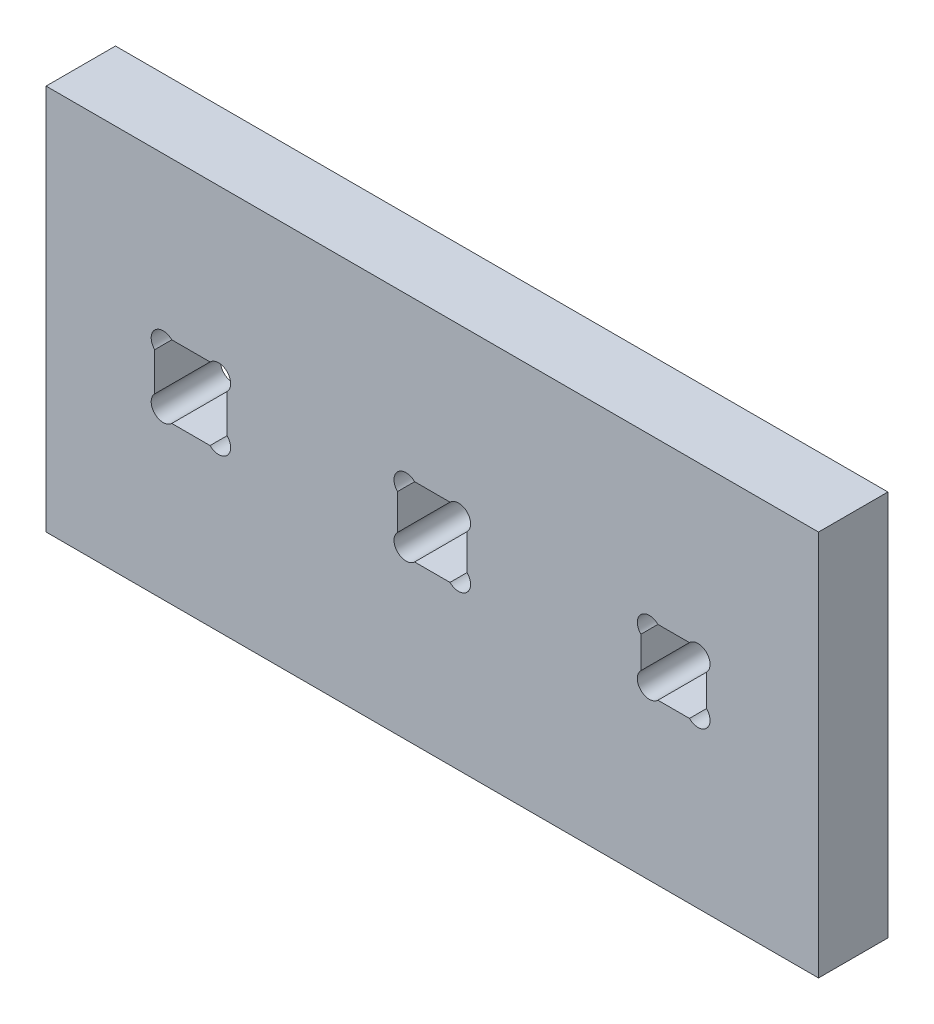
ISO-10303-21;
HEADER;
FILE_DESCRIPTION(('STEP AP214'),'2;1');
FILE_NAME('part.step','',(''),(''),'','','');
FILE_SCHEMA(('AUTOMOTIVE_DESIGN { 1 0 10303 214 1 1 1 1 }'));
ENDSEC;
DATA;
#1=APPLICATION_CONTEXT('core data for automotive mechanical design processes');
#2=APPLICATION_PROTOCOL_DEFINITION('international standard','automotive_design',2000,#1);
#3=PRODUCT_CONTEXT('',#1,'mechanical');
#4=PRODUCT('Part','Part','',(#3));
#5=PRODUCT_RELATED_PRODUCT_CATEGORY('part','',(#4));
#6=PRODUCT_DEFINITION_FORMATION('','',#4);
#7=PRODUCT_DEFINITION_CONTEXT('part definition',#1,'design');
#8=PRODUCT_DEFINITION('design','',#6,#7);
#9=PRODUCT_DEFINITION_SHAPE('','',#8);
#10=(LENGTH_UNIT() NAMED_UNIT(*) SI_UNIT(.MILLI.,.METRE.));
#11=(NAMED_UNIT(*) PLANE_ANGLE_UNIT() SI_UNIT($,.RADIAN.));
#12=(NAMED_UNIT(*) SI_UNIT($,.STERADIAN.) SOLID_ANGLE_UNIT());
#13=UNCERTAINTY_MEASURE_WITH_UNIT(LENGTH_MEASURE(1.E-05),#10,'distance_accuracy_value','');
#14=(GEOMETRIC_REPRESENTATION_CONTEXT(3) GLOBAL_UNCERTAINTY_ASSIGNED_CONTEXT((#13)) GLOBAL_UNIT_ASSIGNED_CONTEXT((#10,
#11,#12)) REPRESENTATION_CONTEXT('',''));
#15=CARTESIAN_POINT('',(0.,0.,0.));
#16=DIRECTION('',(0.,0.,1.));
#17=DIRECTION('',(1.,0.,0.));
#18=AXIS2_PLACEMENT_3D('',#15,#16,#17);
#19=CARTESIAN_POINT('',(-56.2200640302679,-7.27993596973324,18.25625));
#20=DIRECTION('',(0.,0.,-1.));
#21=DIRECTION('',(-1.,0.,0.));
#22=AXIS2_PLACEMENT_3D('',#19,#20,#21);
#23=CYLINDRICAL_SURFACE('',#22,3.17499999999979);
#24=CARTESIAN_POINT('',(-56.2200640302679,-7.27993596973324,0.));
#25=DIRECTION('',(0.,0.,1.));
#26=DIRECTION('',(1.,0.,0.));
#27=AXIS2_PLACEMENT_3D('',#24,#25,#26);
#28=CIRCLE('',#27,3.17499999999979);
#29=CARTESIAN_POINT('',(-53.9750000000002,-5.03487193946666,0.));
#30=VERTEX_POINT('',#29);
#31=CARTESIAN_POINT('',(-58.4651280605356,-9.52499999999984,0.));
#32=VERTEX_POINT('',#31);
#33=EDGE_CURVE('E344',#30,#32,#28,.F.);
#34=ORIENTED_EDGE('',*,*,#33,.T.);
#35=DIRECTION('',(0.,0.,-1.));
#36=VECTOR('',#35,1.);
#37=CARTESIAN_POINT('',(-58.4651280605356,-9.52499999999984,18.25625));
#38=LINE('',#37,#36);
#39=CARTESIAN_POINT('',(-58.4651280605356,-9.52499999999984,18.25625));
#40=VERTEX_POINT('',#39);
#41=EDGE_CURVE('E11',#40,#32,#38,.T.);
#42=ORIENTED_EDGE('',*,*,#41,.F.);
#43=CARTESIAN_POINT('',(-56.2200640302679,-7.27993596973324,18.25625));
#44=DIRECTION('',(0.,0.,1.));
#45=DIRECTION('',(1.,0.,0.));
#46=AXIS2_PLACEMENT_3D('',#43,#44,#45);
#47=CIRCLE('',#46,3.17499999999979);
#48=CARTESIAN_POINT('',(-53.9750000000002,-5.03487193946666,18.25625));
#49=VERTEX_POINT('',#48);
#50=EDGE_CURVE('E530',#49,#40,#47,.F.);
#51=ORIENTED_EDGE('',*,*,#50,.F.);
#52=DIRECTION('',(0.,0.,-1.));
#53=VECTOR('',#52,1.);
#54=CARTESIAN_POINT('',(-53.9750000000002,-5.03487193946666,18.25625));
#55=LINE('',#54,#53);
#56=EDGE_CURVE('E66',#49,#30,#55,.T.);
#57=ORIENTED_EDGE('',*,*,#56,.T.);
#58=EDGE_LOOP('',(#34,#42,#51,#57));
#59=FACE_BOUND('',#58,.T.);
#60=ADVANCED_FACE('F46',(#59),#23,.F.);
#61=CARTESIAN_POINT('',(0.,-9.52499999999985,18.25625));
#62=DIRECTION('',(0.,1.,0.));
#63=DIRECTION('',(-1.,0.,0.));
#64=AXIS2_PLACEMENT_3D('',#61,#62,#63);
#65=PLANE('',#64);
#66=DIRECTION('',(1.,0.,0.));
#67=VECTOR('',#66,1.);
#68=CARTESIAN_POINT('',(0.,-9.52499999999985,0.));
#69=LINE('',#68,#67);
#70=CARTESIAN_POINT('',(-68.5348719394655,-9.52499999999984,0.));
#71=VERTEX_POINT('',#70);
#72=EDGE_CURVE('E347',#71,#32,#69,.T.);
#73=ORIENTED_EDGE('',*,*,#72,.F.);
#74=DIRECTION('',(0.,0.,-1.));
#75=VECTOR('',#74,1.);
#76=CARTESIAN_POINT('',(-68.5348719394655,-9.52499999999984,18.25625));
#77=LINE('',#76,#75);
#78=CARTESIAN_POINT('',(-68.5348719394655,-9.52499999999984,18.25625));
#79=VERTEX_POINT('',#78);
#80=EDGE_CURVE('E57',#79,#71,#77,.T.);
#81=ORIENTED_EDGE('',*,*,#80,.F.);
#82=DIRECTION('',(1.,0.,0.));
#83=VECTOR('',#82,1.);
#84=CARTESIAN_POINT('',(0.,-9.52499999999985,18.25625));
#85=LINE('',#84,#83);
#86=EDGE_CURVE('E533',#79,#40,#85,.T.);
#87=ORIENTED_EDGE('',*,*,#86,.T.);
#88=ORIENTED_EDGE('',*,*,#41,.T.);
#89=EDGE_LOOP('',(#73,#81,#87,#88));
#90=FACE_BOUND('',#89,.T.);
#91=ADVANCED_FACE('F568',(#90),#65,.T.);
#92=CARTESIAN_POINT('',(-70.7799359697326,-7.27993596973325,18.25625));
#93=DIRECTION('',(0.,0.,-1.));
#94=DIRECTION('',(-1.,0.,0.));
#95=AXIS2_PLACEMENT_3D('',#92,#93,#94);
#96=CYLINDRICAL_SURFACE('',#95,3.17499999999942);
#97=CARTESIAN_POINT('',(-70.7799359697326,-7.27993596973325,0.));
#98=DIRECTION('',(0.,0.,1.));
#99=DIRECTION('',(1.,0.,0.));
#100=AXIS2_PLACEMENT_3D('',#97,#98,#99);
#101=CIRCLE('',#100,3.17499999999942);
#102=CARTESIAN_POINT('',(-73.0249999999998,-5.03487193946667,0.));
#103=VERTEX_POINT('',#102);
#104=EDGE_CURVE('E351',#103,#71,#101,.T.);
#105=ORIENTED_EDGE('',*,*,#104,.F.);
#106=DIRECTION('',(0.,0.,-1.));
#107=VECTOR('',#106,1.);
#108=CARTESIAN_POINT('',(-73.0249999999998,-5.03487193946667,18.25625));
#109=LINE('',#108,#107);
#110=CARTESIAN_POINT('',(-73.0249999999998,-5.03487193946667,18.25625));
#111=VERTEX_POINT('',#110);
#112=EDGE_CURVE('E382',#111,#103,#109,.T.);
#113=ORIENTED_EDGE('',*,*,#112,.F.);
#114=CARTESIAN_POINT('',(-70.7799359697326,-7.27993596973325,18.25625));
#115=DIRECTION('',(0.,0.,1.));
#116=DIRECTION('',(1.,0.,0.));
#117=AXIS2_PLACEMENT_3D('',#114,#115,#116);
#118=CIRCLE('',#117,3.17499999999942);
#119=EDGE_CURVE('E537',#111,#79,#118,.T.);
#120=ORIENTED_EDGE('',*,*,#119,.T.);
#121=ORIENTED_EDGE('',*,*,#80,.T.);
#122=EDGE_LOOP('',(#105,#113,#120,#121));
#123=FACE_BOUND('',#122,.T.);
#124=ADVANCED_FACE('F573',(#123),#96,.F.);
#125=CARTESIAN_POINT('',(-73.0249999999998,0.,18.25625));
#126=DIRECTION('',(-1.,0.,0.));
#127=DIRECTION('',(0.,0.,1.));
#128=AXIS2_PLACEMENT_3D('',#125,#126,#127);
#129=PLANE('',#128);
#130=DIRECTION('',(0.,1.,0.));
#131=VECTOR('',#130,1.);
#132=CARTESIAN_POINT('',(-73.0249999999998,0.,0.));
#133=LINE('',#132,#131);
#134=CARTESIAN_POINT('',(-73.0249999999998,5.03487193946562,0.));
#135=VERTEX_POINT('',#134);
#136=EDGE_CURVE('E355',#103,#135,#133,.T.);
#137=ORIENTED_EDGE('',*,*,#136,.T.);
#138=DIRECTION('',(0.,0.,-1.));
#139=VECTOR('',#138,1.);
#140=CARTESIAN_POINT('',(-73.0249999999998,5.03487193946562,18.25625));
#141=LINE('',#140,#139);
#142=CARTESIAN_POINT('',(-73.0249999999998,5.03487193946562,18.25625));
#143=VERTEX_POINT('',#142);
#144=EDGE_CURVE('E378',#143,#135,#141,.T.);
#145=ORIENTED_EDGE('',*,*,#144,.F.);
#146=DIRECTION('',(0.,1.,0.));
#147=VECTOR('',#146,1.);
#148=CARTESIAN_POINT('',(-73.0249999999998,0.,18.25625));
#149=LINE('',#148,#147);
#150=EDGE_CURVE('E541',#111,#143,#149,.T.);
#151=ORIENTED_EDGE('',*,*,#150,.F.);
#152=ORIENTED_EDGE('',*,*,#112,.T.);
#153=EDGE_LOOP('',(#137,#145,#151,#152));
#154=FACE_BOUND('',#153,.T.);
#155=ADVANCED_FACE('F549',(#154),#129,.F.);
#156=CARTESIAN_POINT('',(-70.7799359697332,7.27993596973325,18.25625));
#157=DIRECTION('',(0.,0.,-1.));
#158=DIRECTION('',(-1.,0.,0.));
#159=AXIS2_PLACEMENT_3D('',#156,#157,#158);
#160=CYLINDRICAL_SURFACE('',#159,3.17499999999979);
#161=CARTESIAN_POINT('',(-70.7799359697332,7.27993596973325,0.));
#162=DIRECTION('',(0.,0.,1.));
#163=DIRECTION('',(1.,0.,0.));
#164=AXIS2_PLACEMENT_3D('',#161,#162,#163);
#165=CIRCLE('',#164,3.17499999999979);
#166=CARTESIAN_POINT('',(-68.5348719394655,9.52499999999984,0.));
#167=VERTEX_POINT('',#166);
#168=EDGE_CURVE('E358',#135,#167,#165,.F.);
#169=ORIENTED_EDGE('',*,*,#168,.T.);
#170=DIRECTION('',(0.,0.,-1.));
#171=VECTOR('',#170,1.);
#172=CARTESIAN_POINT('',(-68.5348719394655,9.52499999999984,18.25625));
#173=LINE('',#172,#171);
#174=CARTESIAN_POINT('',(-68.5348719394655,9.52499999999984,18.25625));
#175=VERTEX_POINT('',#174);
#176=EDGE_CURVE('E260',#175,#167,#173,.T.);
#177=ORIENTED_EDGE('',*,*,#176,.F.);
#178=CARTESIAN_POINT('',(-70.7799359697332,7.27993596973325,18.25625));
#179=DIRECTION('',(0.,0.,1.));
#180=DIRECTION('',(1.,0.,0.));
#181=AXIS2_PLACEMENT_3D('',#178,#179,#180);
#182=CIRCLE('',#181,3.17499999999979);
#183=EDGE_CURVE('E246',#143,#175,#182,.F.);
#184=ORIENTED_EDGE('',*,*,#183,.F.);
#185=ORIENTED_EDGE('',*,*,#144,.T.);
#186=EDGE_LOOP('',(#169,#177,#184,#185));
#187=FACE_BOUND('',#186,.T.);
#188=ADVANCED_FACE('F553',(#187),#160,.F.);
#189=CARTESIAN_POINT('',(0.,9.52499999999982,18.25625));
#190=DIRECTION('',(0.,1.,0.));
#191=DIRECTION('',(-1.,0.,0.));
#192=AXIS2_PLACEMENT_3D('',#189,#190,#191);
#193=PLANE('',#192);
#194=DIRECTION('',(1.,0.,0.));
#195=VECTOR('',#194,1.);
#196=CARTESIAN_POINT('',(0.,9.52499999999982,0.));
#197=LINE('',#196,#195);
#198=CARTESIAN_POINT('',(-58.4651280605356,9.52499999999984,0.));
#199=VERTEX_POINT('',#198);
#200=EDGE_CURVE('E256',#167,#199,#197,.T.);
#201=ORIENTED_EDGE('',*,*,#200,.T.);
#202=DIRECTION('',(0.,0.,-1.));
#203=VECTOR('',#202,1.);
#204=CARTESIAN_POINT('',(-58.4651280605356,9.52499999999984,18.25625));
#205=LINE('',#204,#203);
#206=CARTESIAN_POINT('',(-58.4651280605356,9.52499999999984,18.25625));
#207=VERTEX_POINT('',#206);
#208=EDGE_CURVE('E253',#207,#199,#205,.T.);
#209=ORIENTED_EDGE('',*,*,#208,.F.);
#210=DIRECTION('',(1.,0.,0.));
#211=VECTOR('',#210,1.);
#212=CARTESIAN_POINT('',(0.,9.52499999999982,18.25625));
#213=LINE('',#212,#211);
#214=EDGE_CURVE('E239',#175,#207,#213,.T.);
#215=ORIENTED_EDGE('',*,*,#214,.F.);
#216=ORIENTED_EDGE('',*,*,#176,.T.);
#217=EDGE_LOOP('',(#201,#209,#215,#216));
#218=FACE_BOUND('',#217,.T.);
#219=ADVANCED_FACE('F254',(#218),#193,.F.);
#220=CARTESIAN_POINT('',(-56.2200640302679,7.27993596973325,18.25625));
#221=DIRECTION('',(0.,0.,-1.));
#222=DIRECTION('',(-1.,0.,0.));
#223=AXIS2_PLACEMENT_3D('',#220,#221,#222);
#224=CYLINDRICAL_SURFACE('',#223,3.17499999999979);
#225=CARTESIAN_POINT('',(-56.2200640302679,7.27993596973325,0.));
#226=DIRECTION('',(0.,0.,1.));
#227=DIRECTION('',(1.,0.,0.));
#228=AXIS2_PLACEMENT_3D('',#225,#226,#227);
#229=CIRCLE('',#228,3.17499999999979);
#230=CARTESIAN_POINT('',(-53.9750000000002,5.03487193946667,0.));
#231=VERTEX_POINT('',#230);
#232=EDGE_CURVE('E363',#199,#231,#229,.F.);
#233=ORIENTED_EDGE('',*,*,#232,.T.);
#234=DIRECTION('',(0.,0.,-1.));
#235=VECTOR('',#234,1.);
#236=CARTESIAN_POINT('',(-53.9750000000002,5.03487193946667,18.25625));
#237=LINE('',#236,#235);
#238=CARTESIAN_POINT('',(-53.9750000000002,5.03487193946667,18.25625));
#239=VERTEX_POINT('',#238);
#240=EDGE_CURVE('E152',#239,#231,#237,.T.);
#241=ORIENTED_EDGE('',*,*,#240,.F.);
#242=CARTESIAN_POINT('',(-56.2200640302679,7.27993596973325,18.25625));
#243=DIRECTION('',(0.,0.,1.));
#244=DIRECTION('',(1.,0.,0.));
#245=AXIS2_PLACEMENT_3D('',#242,#243,#244);
#246=CIRCLE('',#245,3.17499999999979);
#247=EDGE_CURVE('E244',#207,#239,#246,.F.);
#248=ORIENTED_EDGE('',*,*,#247,.F.);
#249=ORIENTED_EDGE('',*,*,#208,.T.);
#250=EDGE_LOOP('',(#233,#241,#248,#249));
#251=FACE_BOUND('',#250,.T.);
#252=ADVANCED_FACE('F262',(#251),#224,.F.);
#253=CARTESIAN_POINT('',(69.8909359697328,-6.39093596973289,18.25625));
#254=DIRECTION('',(0.,0.,-1.));
#255=DIRECTION('',(-1.,0.,0.));
#256=AXIS2_PLACEMENT_3D('',#253,#254,#255);
#257=CYLINDRICAL_SURFACE('',#256,3.17499999999979);
#258=CARTESIAN_POINT('',(69.8909359697328,-6.39093596973289,0.));
#259=DIRECTION('',(0.,0.,1.));
#260=DIRECTION('',(1.,0.,0.));
#261=AXIS2_PLACEMENT_3D('',#258,#259,#260);
#262=CIRCLE('',#261,3.17499999999979);
#263=CARTESIAN_POINT('',(72.136,-4.14587193946578,0.));
#264=VERTEX_POINT('',#263);
#265=CARTESIAN_POINT('',(67.6458719394657,-8.636,0.));
#266=VERTEX_POINT('',#265);
#267=EDGE_CURVE('E315',#264,#266,#262,.F.);
#268=ORIENTED_EDGE('',*,*,#267,.T.);
#269=DIRECTION('',(0.,0.,-1.));
#270=VECTOR('',#269,1.);
#271=CARTESIAN_POINT('',(67.6458719394657,-8.636,18.25625));
#272=LINE('',#271,#270);
#273=CARTESIAN_POINT('',(67.6458719394657,-8.636,18.25625));
#274=VERTEX_POINT('',#273);
#275=EDGE_CURVE('E373',#274,#266,#272,.T.);
#276=ORIENTED_EDGE('',*,*,#275,.F.);
#277=CARTESIAN_POINT('',(69.8909359697328,-6.39093596973289,18.25625));
#278=DIRECTION('',(0.,0.,1.));
#279=DIRECTION('',(1.,0.,0.));
#280=AXIS2_PLACEMENT_3D('',#277,#278,#279);
#281=CIRCLE('',#280,3.17499999999979);
#282=CARTESIAN_POINT('',(72.136,-4.14587193946578,18.25625));
#283=VERTEX_POINT('',#282);
#284=EDGE_CURVE('E503',#283,#274,#281,.F.);
#285=ORIENTED_EDGE('',*,*,#284,.F.);
#286=DIRECTION('',(0.,0.,-1.));
#287=VECTOR('',#286,1.);
#288=CARTESIAN_POINT('',(72.136,-4.14587193946578,18.25625));
#289=LINE('',#288,#287);
#290=EDGE_CURVE('E387',#283,#264,#289,.T.);
#291=ORIENTED_EDGE('',*,*,#290,.T.);
#292=EDGE_LOOP('',(#268,#276,#285,#291));
#293=FACE_BOUND('',#292,.T.);
#294=ADVANCED_FACE('F606',(#293),#257,.F.);
#295=CARTESIAN_POINT('',(0.,-8.636,18.25625));
#296=DIRECTION('',(0.,1.,0.));
#297=DIRECTION('',(0.,0.,1.));
#298=AXIS2_PLACEMENT_3D('',#295,#296,#297);
#299=PLANE('',#298);
#300=DIRECTION('',(1.,0.,0.));
#301=VECTOR('',#300,1.);
#302=CARTESIAN_POINT('',(0.,-8.636,0.));
#303=LINE('',#302,#301);
#304=CARTESIAN_POINT('',(59.3541280605343,-8.636,0.));
#305=VERTEX_POINT('',#304);
#306=EDGE_CURVE('E319',#305,#266,#303,.T.);
#307=ORIENTED_EDGE('',*,*,#306,.F.);
#308=DIRECTION('',(0.,0.,-1.));
#309=VECTOR('',#308,1.);
#310=CARTESIAN_POINT('',(59.3541280605343,-8.636,18.25625));
#311=LINE('',#310,#309);
#312=CARTESIAN_POINT('',(59.3541280605343,-8.636,18.25625));
#313=VERTEX_POINT('',#312);
#314=EDGE_CURVE('E409',#313,#305,#311,.T.);
#315=ORIENTED_EDGE('',*,*,#314,.F.);
#316=DIRECTION('',(1.,0.,0.));
#317=VECTOR('',#316,1.);
#318=CARTESIAN_POINT('',(0.,-8.636,18.25625));
#319=LINE('',#318,#317);
#320=EDGE_CURVE('E506',#313,#274,#319,.T.);
#321=ORIENTED_EDGE('',*,*,#320,.T.);
#322=ORIENTED_EDGE('',*,*,#275,.T.);
#323=EDGE_LOOP('',(#307,#315,#321,#322));
#324=FACE_BOUND('',#323,.T.);
#325=ADVANCED_FACE('F602',(#324),#299,.T.);
#326=CARTESIAN_POINT('',(57.1090640302672,-6.39093596973289,18.25625));
#327=DIRECTION('',(0.,0.,-1.));
#328=DIRECTION('',(-1.,0.,0.));
#329=AXIS2_PLACEMENT_3D('',#326,#327,#328);
#330=CYLINDRICAL_SURFACE('',#329,3.17499999999979);
#331=CARTESIAN_POINT('',(57.1090640302672,-6.39093596973289,0.));
#332=DIRECTION('',(0.,0.,1.));
#333=DIRECTION('',(1.,0.,0.));
#334=AXIS2_PLACEMENT_3D('',#331,#332,#333);
#335=CIRCLE('',#334,3.17499999999979);
#336=CARTESIAN_POINT('',(54.864,-4.14587193946577,0.));
#337=VERTEX_POINT('',#336);
#338=EDGE_CURVE('E323',#337,#305,#335,.T.);
#339=ORIENTED_EDGE('',*,*,#338,.F.);
#340=DIRECTION('',(0.,0.,-1.));
#341=VECTOR('',#340,1.);
#342=CARTESIAN_POINT('',(54.864,-4.14587193946577,18.25625));
#343=LINE('',#342,#341);
#344=CARTESIAN_POINT('',(54.864,-4.14587193946577,18.25625));
#345=VERTEX_POINT('',#344);
#346=EDGE_CURVE('E406',#345,#337,#343,.T.);
#347=ORIENTED_EDGE('',*,*,#346,.F.);
#348=CARTESIAN_POINT('',(57.1090640302672,-6.39093596973289,18.25625));
#349=DIRECTION('',(0.,0.,1.));
#350=DIRECTION('',(1.,0.,0.));
#351=AXIS2_PLACEMENT_3D('',#348,#349,#350);
#352=CIRCLE('',#351,3.17499999999979);
#353=EDGE_CURVE('E510',#345,#313,#352,.T.);
#354=ORIENTED_EDGE('',*,*,#353,.T.);
#355=ORIENTED_EDGE('',*,*,#314,.T.);
#356=EDGE_LOOP('',(#339,#347,#354,#355));
#357=FACE_BOUND('',#356,.T.);
#358=ADVANCED_FACE('F598',(#357),#330,.F.);
#359=CARTESIAN_POINT('',(54.864,0.,18.25625));
#360=DIRECTION('',(-1.,0.,0.));
#361=DIRECTION('',(0.,0.,1.));
#362=AXIS2_PLACEMENT_3D('',#359,#360,#361);
#363=PLANE('',#362);
#364=DIRECTION('',(0.,1.,0.));
#365=VECTOR('',#364,1.);
#366=CARTESIAN_POINT('',(54.864,0.,0.));
#367=LINE('',#366,#365);
#368=CARTESIAN_POINT('',(54.864,4.14587193946576,0.));
#369=VERTEX_POINT('',#368);
#370=EDGE_CURVE('E327',#337,#369,#367,.T.);
#371=ORIENTED_EDGE('',*,*,#370,.T.);
#372=DIRECTION('',(0.,0.,-1.));
#373=VECTOR('',#372,1.);
#374=CARTESIAN_POINT('',(54.864,4.14587193946576,18.25625));
#375=LINE('',#374,#373);
#376=CARTESIAN_POINT('',(54.864,4.14587193946576,18.25625));
#377=VERTEX_POINT('',#376);
#378=EDGE_CURVE('E402',#377,#369,#375,.T.);
#379=ORIENTED_EDGE('',*,*,#378,.F.);
#380=DIRECTION('',(0.,1.,0.));
#381=VECTOR('',#380,1.);
#382=CARTESIAN_POINT('',(54.864,0.,18.25625));
#383=LINE('',#382,#381);
#384=EDGE_CURVE('E514',#345,#377,#383,.T.);
#385=ORIENTED_EDGE('',*,*,#384,.F.);
#386=ORIENTED_EDGE('',*,*,#346,.T.);
#387=EDGE_LOOP('',(#371,#379,#385,#386));
#388=FACE_BOUND('',#387,.T.);
#389=ADVANCED_FACE('F594',(#388),#363,.F.);
#390=CARTESIAN_POINT('',(57.1090640302672,6.39093596973288,18.25625));
#391=DIRECTION('',(0.,0.,-1.));
#392=DIRECTION('',(-1.,0.,0.));
#393=AXIS2_PLACEMENT_3D('',#390,#391,#392);
#394=CYLINDRICAL_SURFACE('',#393,3.17499999999979);
#395=CARTESIAN_POINT('',(57.1090640302672,6.39093596973288,0.));
#396=DIRECTION('',(0.,0.,1.));
#397=DIRECTION('',(1.,0.,0.));
#398=AXIS2_PLACEMENT_3D('',#395,#396,#397);
#399=CIRCLE('',#398,3.17499999999979);
#400=CARTESIAN_POINT('',(59.3541280605343,8.636,0.));
#401=VERTEX_POINT('',#400);
#402=EDGE_CURVE('E330',#369,#401,#399,.F.);
#403=ORIENTED_EDGE('',*,*,#402,.T.);
#404=DIRECTION('',(0.,0.,-1.));
#405=VECTOR('',#404,1.);
#406=CARTESIAN_POINT('',(59.3541280605343,8.636,18.25625));
#407=LINE('',#406,#405);
#408=CARTESIAN_POINT('',(59.3541280605343,8.636,18.25625));
#409=VERTEX_POINT('',#408);
#410=EDGE_CURVE('E398',#409,#401,#407,.T.);
#411=ORIENTED_EDGE('',*,*,#410,.F.);
#412=CARTESIAN_POINT('',(57.1090640302672,6.39093596973288,18.25625));
#413=DIRECTION('',(0.,0.,1.));
#414=DIRECTION('',(1.,0.,0.));
#415=AXIS2_PLACEMENT_3D('',#412,#413,#414);
#416=CIRCLE('',#415,3.17499999999979);
#417=EDGE_CURVE('E517',#377,#409,#416,.F.);
#418=ORIENTED_EDGE('',*,*,#417,.F.);
#419=ORIENTED_EDGE('',*,*,#378,.T.);
#420=EDGE_LOOP('',(#403,#411,#418,#419));
#421=FACE_BOUND('',#420,.T.);
#422=ADVANCED_FACE('F590',(#421),#394,.F.);
#423=CARTESIAN_POINT('',(0.,8.636,18.25625));
#424=DIRECTION('',(0.,1.,0.));
#425=DIRECTION('',(0.,0.,1.));
#426=AXIS2_PLACEMENT_3D('',#423,#424,#425);
#427=PLANE('',#426);
#428=DIRECTION('',(1.,0.,0.));
#429=VECTOR('',#428,1.);
#430=CARTESIAN_POINT('',(0.,8.636,0.));
#431=LINE('',#430,#429);
#432=CARTESIAN_POINT('',(67.6458719394657,8.636,0.));
#433=VERTEX_POINT('',#432);
#434=EDGE_CURVE('E333',#401,#433,#431,.T.);
#435=ORIENTED_EDGE('',*,*,#434,.T.);
#436=DIRECTION('',(0.,0.,-1.));
#437=VECTOR('',#436,1.);
#438=CARTESIAN_POINT('',(67.6458719394657,8.636,18.25625));
#439=LINE('',#438,#437);
#440=CARTESIAN_POINT('',(67.6458719394657,8.636,18.25625));
#441=VERTEX_POINT('',#440);
#442=EDGE_CURVE('E394',#441,#433,#439,.T.);
#443=ORIENTED_EDGE('',*,*,#442,.F.);
#444=DIRECTION('',(1.,0.,0.));
#445=VECTOR('',#444,1.);
#446=CARTESIAN_POINT('',(0.,8.636,18.25625));
#447=LINE('',#446,#445);
#448=EDGE_CURVE('E520',#409,#441,#447,.T.);
#449=ORIENTED_EDGE('',*,*,#448,.F.);
#450=ORIENTED_EDGE('',*,*,#410,.T.);
#451=EDGE_LOOP('',(#435,#443,#449,#450));
#452=FACE_BOUND('',#451,.T.);
#453=ADVANCED_FACE('F586',(#452),#427,.F.);
#454=CARTESIAN_POINT('',(69.8909359697328,6.39093596973288,18.25625));
#455=DIRECTION('',(0.,0.,-1.));
#456=DIRECTION('',(-1.,0.,0.));
#457=AXIS2_PLACEMENT_3D('',#454,#455,#456);
#458=CYLINDRICAL_SURFACE('',#457,3.17499999999979);
#459=CARTESIAN_POINT('',(69.8909359697328,6.39093596973288,0.));
#460=DIRECTION('',(0.,0.,1.));
#461=DIRECTION('',(1.,0.,0.));
#462=AXIS2_PLACEMENT_3D('',#459,#460,#461);
#463=CIRCLE('',#462,3.17499999999979);
#464=CARTESIAN_POINT('',(72.136,4.14587193946577,0.));
#465=VERTEX_POINT('',#464);
#466=EDGE_CURVE('E336',#433,#465,#463,.F.);
#467=ORIENTED_EDGE('',*,*,#466,.T.);
#468=DIRECTION('',(0.,0.,-1.));
#469=VECTOR('',#468,1.);
#470=CARTESIAN_POINT('',(72.136,4.14587193946577,18.25625));
#471=LINE('',#470,#469);
#472=CARTESIAN_POINT('',(72.136,4.14587193946577,18.25625));
#473=VERTEX_POINT('',#472);
#474=EDGE_CURVE('E390',#473,#465,#471,.T.);
#475=ORIENTED_EDGE('',*,*,#474,.F.);
#476=CARTESIAN_POINT('',(69.8909359697328,6.39093596973288,18.25625));
#477=DIRECTION('',(0.,0.,1.));
#478=DIRECTION('',(1.,0.,0.));
#479=AXIS2_PLACEMENT_3D('',#476,#477,#478);
#480=CIRCLE('',#479,3.17499999999979);
#481=EDGE_CURVE('E523',#441,#473,#480,.F.);
#482=ORIENTED_EDGE('',*,*,#481,.F.);
#483=ORIENTED_EDGE('',*,*,#442,.T.);
#484=EDGE_LOOP('',(#467,#475,#482,#483));
#485=FACE_BOUND('',#484,.T.);
#486=ADVANCED_FACE('F582',(#485),#458,.F.);
#487=CARTESIAN_POINT('',(6.89893596973283,-6.89893596973289,18.25625));
#488=DIRECTION('',(0.,0.,-1.));
#489=DIRECTION('',(-1.,0.,0.));
#490=AXIS2_PLACEMENT_3D('',#487,#488,#489);
#491=CYLINDRICAL_SURFACE('',#490,3.17499999999979);
#492=CARTESIAN_POINT('',(6.89893596973283,-6.89893596973289,0.));
#493=DIRECTION('',(0.,0.,1.));
#494=DIRECTION('',(1.,0.,0.));
#495=AXIS2_PLACEMENT_3D('',#492,#493,#494);
#496=CIRCLE('',#495,3.17499999999979);
#497=CARTESIAN_POINT('',(9.144,-4.65387193946578,0.));
#498=VERTEX_POINT('',#497);
#499=CARTESIAN_POINT('',(4.65387193946566,-9.144,0.));
#500=VERTEX_POINT('',#499);
#501=EDGE_CURVE('E286',#498,#500,#496,.F.);
#502=ORIENTED_EDGE('',*,*,#501,.T.);
#503=DIRECTION('',(0.,0.,-1.));
#504=VECTOR('',#503,1.);
#505=CARTESIAN_POINT('',(4.65387193946566,-9.144,18.25625));
#506=LINE('',#505,#504);
#507=CARTESIAN_POINT('',(4.65387193946566,-9.144,18.25625));
#508=VERTEX_POINT('',#507);
#509=EDGE_CURVE('E391',#508,#500,#506,.T.);
#510=ORIENTED_EDGE('',*,*,#509,.F.);
#511=CARTESIAN_POINT('',(6.89893596973283,-6.89893596973289,18.25625));
#512=DIRECTION('',(0.,0.,1.));
#513=DIRECTION('',(1.,0.,0.));
#514=AXIS2_PLACEMENT_3D('',#511,#512,#513);
#515=CIRCLE('',#514,3.17499999999979);
#516=CARTESIAN_POINT('',(9.144,-4.65387193946578,18.25625));
#517=VERTEX_POINT('',#516);
#518=EDGE_CURVE('E470',#517,#508,#515,.F.);
#519=ORIENTED_EDGE('',*,*,#518,.F.);
#520=DIRECTION('',(0.,0.,-1.));
#521=VECTOR('',#520,1.);
#522=CARTESIAN_POINT('',(9.144,-4.65387193946578,18.25625));
#523=LINE('',#522,#521);
#524=EDGE_CURVE('E414',#517,#498,#523,.T.);
#525=ORIENTED_EDGE('',*,*,#524,.T.);
#526=EDGE_LOOP('',(#502,#510,#519,#525));
#527=FACE_BOUND('',#526,.T.);
#528=ADVANCED_FACE('F585',(#527),#491,.F.);
#529=CARTESIAN_POINT('',(0.,-9.144,18.25625));
#530=DIRECTION('',(0.,1.,0.));
#531=DIRECTION('',(0.,0.,1.));
#532=AXIS2_PLACEMENT_3D('',#529,#530,#531);
#533=PLANE('',#532);
#534=DIRECTION('',(1.,0.,0.));
#535=VECTOR('',#534,1.);
#536=CARTESIAN_POINT('',(0.,-9.144,0.));
#537=LINE('',#536,#535);
#538=CARTESIAN_POINT('',(-4.65387193946566,-9.144,0.));
#539=VERTEX_POINT('',#538);
#540=EDGE_CURVE('E290',#539,#500,#537,.T.);
#541=ORIENTED_EDGE('',*,*,#540,.F.);
#542=DIRECTION('',(0.,0.,-1.));
#543=VECTOR('',#542,1.);
#544=CARTESIAN_POINT('',(-4.65387193946566,-9.144,18.25625));
#545=LINE('',#544,#543);
#546=CARTESIAN_POINT('',(-4.65387193946566,-9.144,18.25625));
#547=VERTEX_POINT('',#546);
#548=EDGE_CURVE('E435',#547,#539,#545,.T.);
#549=ORIENTED_EDGE('',*,*,#548,.F.);
#550=DIRECTION('',(1.,0.,0.));
#551=VECTOR('',#550,1.);
#552=CARTESIAN_POINT('',(0.,-9.144,18.25625));
#553=LINE('',#552,#551);
#554=EDGE_CURVE('E475',#547,#508,#553,.T.);
#555=ORIENTED_EDGE('',*,*,#554,.T.);
#556=ORIENTED_EDGE('',*,*,#509,.T.);
#557=EDGE_LOOP('',(#541,#549,#555,#556));
#558=FACE_BOUND('',#557,.T.);
#559=ADVANCED_FACE('F633',(#558),#533,.T.);
#560=CARTESIAN_POINT('',(-6.89893596973283,-6.89893596973289,18.25625));
#561=DIRECTION('',(0.,0.,-1.));
#562=DIRECTION('',(-1.,0.,0.));
#563=AXIS2_PLACEMENT_3D('',#560,#561,#562);
#564=CYLINDRICAL_SURFACE('',#563,3.17499999999979);
#565=CARTESIAN_POINT('',(-6.89893596973283,-6.89893596973289,0.));
#566=DIRECTION('',(0.,0.,1.));
#567=DIRECTION('',(1.,0.,0.));
#568=AXIS2_PLACEMENT_3D('',#565,#566,#567);
#569=CIRCLE('',#568,3.17499999999979);
#570=CARTESIAN_POINT('',(-9.144,-4.65387193946578,0.));
#571=VERTEX_POINT('',#570);
#572=EDGE_CURVE('E294',#571,#539,#569,.T.);
#573=ORIENTED_EDGE('',*,*,#572,.F.);
#574=DIRECTION('',(0.,0.,-1.));
#575=VECTOR('',#574,1.);
#576=CARTESIAN_POINT('',(-9.144,-4.65387193946578,18.25625));
#577=LINE('',#576,#575);
#578=CARTESIAN_POINT('',(-9.144,-4.65387193946578,18.25625));
#579=VERTEX_POINT('',#578);
#580=EDGE_CURVE('E432',#579,#571,#577,.T.);
#581=ORIENTED_EDGE('',*,*,#580,.F.);
#582=CARTESIAN_POINT('',(-6.89893596973283,-6.89893596973289,18.25625));
#583=DIRECTION('',(0.,0.,1.));
#584=DIRECTION('',(1.,0.,0.));
#585=AXIS2_PLACEMENT_3D('',#582,#583,#584);
#586=CIRCLE('',#585,3.17499999999979);
#587=EDGE_CURVE('E483',#579,#547,#586,.T.);
#588=ORIENTED_EDGE('',*,*,#587,.T.);
#589=ORIENTED_EDGE('',*,*,#548,.T.);
#590=EDGE_LOOP('',(#573,#581,#588,#589));
#591=FACE_BOUND('',#590,.T.);
#592=ADVANCED_FACE('F629',(#591),#564,.F.);
#593=CARTESIAN_POINT('',(-9.144,0.,18.25625));
#594=DIRECTION('',(-1.,0.,0.));
#595=DIRECTION('',(0.,0.,1.));
#596=AXIS2_PLACEMENT_3D('',#593,#594,#595);
#597=PLANE('',#596);
#598=DIRECTION('',(0.,1.,0.));
#599=VECTOR('',#598,1.);
#600=CARTESIAN_POINT('',(-9.144,0.,0.));
#601=LINE('',#600,#599);
#602=CARTESIAN_POINT('',(-9.144,4.65387193946578,0.));
#603=VERTEX_POINT('',#602);
#604=EDGE_CURVE('E298',#571,#603,#601,.T.);
#605=ORIENTED_EDGE('',*,*,#604,.T.);
#606=DIRECTION('',(0.,0.,-1.));
#607=VECTOR('',#606,1.);
#608=CARTESIAN_POINT('',(-9.144,4.65387193946578,18.25625));
#609=LINE('',#608,#607);
#610=CARTESIAN_POINT('',(-9.144,4.65387193946578,18.25625));
#611=VERTEX_POINT('',#610);
#612=EDGE_CURVE('E428',#611,#603,#609,.T.);
#613=ORIENTED_EDGE('',*,*,#612,.F.);
#614=DIRECTION('',(0.,1.,0.));
#615=VECTOR('',#614,1.);
#616=CARTESIAN_POINT('',(-9.144,0.,18.25625));
#617=LINE('',#616,#615);
#618=EDGE_CURVE('E487',#579,#611,#617,.T.);
#619=ORIENTED_EDGE('',*,*,#618,.F.);
#620=ORIENTED_EDGE('',*,*,#580,.T.);
#621=EDGE_LOOP('',(#605,#613,#619,#620));
#622=FACE_BOUND('',#621,.T.);
#623=ADVANCED_FACE('F625',(#622),#597,.F.);
#624=CARTESIAN_POINT('',(-6.89893596973283,6.89893596973289,18.25625));
#625=DIRECTION('',(0.,0.,-1.));
#626=DIRECTION('',(-1.,0.,0.));
#627=AXIS2_PLACEMENT_3D('',#624,#625,#626);
#628=CYLINDRICAL_SURFACE('',#627,3.17499999999979);
#629=CARTESIAN_POINT('',(-6.89893596973283,6.89893596973289,0.));
#630=DIRECTION('',(0.,0.,1.));
#631=DIRECTION('',(1.,0.,0.));
#632=AXIS2_PLACEMENT_3D('',#629,#630,#631);
#633=CIRCLE('',#632,3.17499999999979);
#634=CARTESIAN_POINT('',(-4.65387193946566,9.144,0.));
#635=VERTEX_POINT('',#634);
#636=EDGE_CURVE('E301',#603,#635,#633,.F.);
#637=ORIENTED_EDGE('',*,*,#636,.T.);
#638=DIRECTION('',(0.,0.,-1.));
#639=VECTOR('',#638,1.);
#640=CARTESIAN_POINT('',(-4.65387193946566,9.144,18.25625));
#641=LINE('',#640,#639);
#642=CARTESIAN_POINT('',(-4.65387193946566,9.144,18.25625));
#643=VERTEX_POINT('',#642);
#644=EDGE_CURVE('E424',#643,#635,#641,.T.);
#645=ORIENTED_EDGE('',*,*,#644,.F.);
#646=CARTESIAN_POINT('',(-6.89893596973283,6.89893596973289,18.25625));
#647=DIRECTION('',(0.,0.,1.));
#648=DIRECTION('',(1.,0.,0.));
#649=AXIS2_PLACEMENT_3D('',#646,#647,#648);
#650=CIRCLE('',#649,3.17499999999979);
#651=EDGE_CURVE('E490',#611,#643,#650,.F.);
#652=ORIENTED_EDGE('',*,*,#651,.F.);
#653=ORIENTED_EDGE('',*,*,#612,.T.);
#654=EDGE_LOOP('',(#637,#645,#652,#653));
#655=FACE_BOUND('',#654,.T.);
#656=ADVANCED_FACE('F621',(#655),#628,.F.);
#657=CARTESIAN_POINT('',(0.,9.144,18.25625));
#658=DIRECTION('',(0.,1.,0.));
#659=DIRECTION('',(0.,0.,1.));
#660=AXIS2_PLACEMENT_3D('',#657,#658,#659);
#661=PLANE('',#660);
#662=DIRECTION('',(1.,0.,0.));
#663=VECTOR('',#662,1.);
#664=CARTESIAN_POINT('',(0.,9.144,0.));
#665=LINE('',#664,#663);
#666=CARTESIAN_POINT('',(4.65387193946566,9.144,0.));
#667=VERTEX_POINT('',#666);
#668=EDGE_CURVE('E304',#635,#667,#665,.T.);
#669=ORIENTED_EDGE('',*,*,#668,.T.);
#670=DIRECTION('',(0.,0.,-1.));
#671=VECTOR('',#670,1.);
#672=CARTESIAN_POINT('',(4.65387193946566,9.144,18.25625));
#673=LINE('',#672,#671);
#674=CARTESIAN_POINT('',(4.65387193946566,9.144,18.25625));
#675=VERTEX_POINT('',#674);
#676=EDGE_CURVE('E420',#675,#667,#673,.T.);
#677=ORIENTED_EDGE('',*,*,#676,.F.);
#678=DIRECTION('',(1.,0.,0.));
#679=VECTOR('',#678,1.);
#680=CARTESIAN_POINT('',(0.,9.144,18.25625));
#681=LINE('',#680,#679);
#682=EDGE_CURVE('E493',#643,#675,#681,.T.);
#683=ORIENTED_EDGE('',*,*,#682,.F.);
#684=ORIENTED_EDGE('',*,*,#644,.T.);
#685=EDGE_LOOP('',(#669,#677,#683,#684));
#686=FACE_BOUND('',#685,.T.);
#687=ADVANCED_FACE('F617',(#686),#661,.F.);
#688=CARTESIAN_POINT('',(6.89893596973283,6.89893596973289,18.25625));
#689=DIRECTION('',(0.,0.,-1.));
#690=DIRECTION('',(-1.,0.,0.));
#691=AXIS2_PLACEMENT_3D('',#688,#689,#690);
#692=CYLINDRICAL_SURFACE('',#691,3.17499999999979);
#693=CARTESIAN_POINT('',(6.89893596973283,6.89893596973289,0.));
#694=DIRECTION('',(0.,0.,1.));
#695=DIRECTION('',(1.,0.,0.));
#696=AXIS2_PLACEMENT_3D('',#693,#694,#695);
#697=CIRCLE('',#696,3.17499999999979);
#698=CARTESIAN_POINT('',(9.144,4.65387193946578,0.));
#699=VERTEX_POINT('',#698);
#700=EDGE_CURVE('E307',#667,#699,#697,.F.);
#701=ORIENTED_EDGE('',*,*,#700,.T.);
#702=DIRECTION('',(0.,0.,-1.));
#703=VECTOR('',#702,1.);
#704=CARTESIAN_POINT('',(9.144,4.65387193946578,18.25625));
#705=LINE('',#704,#703);
#706=CARTESIAN_POINT('',(9.144,4.65387193946578,18.25625));
#707=VERTEX_POINT('',#706);
#708=EDGE_CURVE('E417',#707,#699,#705,.T.);
#709=ORIENTED_EDGE('',*,*,#708,.F.);
#710=CARTESIAN_POINT('',(6.89893596973283,6.89893596973289,18.25625));
#711=DIRECTION('',(0.,0.,1.));
#712=DIRECTION('',(1.,0.,0.));
#713=AXIS2_PLACEMENT_3D('',#710,#711,#712);
#714=CIRCLE('',#713,3.17499999999979);
#715=EDGE_CURVE('E496',#675,#707,#714,.F.);
#716=ORIENTED_EDGE('',*,*,#715,.F.);
#717=ORIENTED_EDGE('',*,*,#676,.T.);
#718=EDGE_LOOP('',(#701,#709,#716,#717));
#719=FACE_BOUND('',#718,.T.);
#720=ADVANCED_FACE('F614',(#719),#692,.F.);
#721=CARTESIAN_POINT('',(101.6,0.,18.25625));
#722=DIRECTION('',(1.,0.,0.));
#723=DIRECTION('',(0.,1.,0.));
#724=AXIS2_PLACEMENT_3D('',#721,#722,#723);
#725=PLANE('',#724);
#726=DIRECTION('',(0.,-1.,0.));
#727=VECTOR('',#726,1.);
#728=CARTESIAN_POINT('',(101.6,0.,0.));
#729=LINE('',#728,#727);
#730=CARTESIAN_POINT('',(101.6,50.8,0.));
#731=VERTEX_POINT('',#730);
#732=CARTESIAN_POINT('',(101.6,-50.8,0.));
#733=VERTEX_POINT('',#732);
#734=EDGE_CURVE('E271',#731,#733,#729,.T.);
#735=ORIENTED_EDGE('',*,*,#734,.F.);
#736=DIRECTION('',(0.,0.,-1.));
#737=VECTOR('',#736,1.);
#738=CARTESIAN_POINT('',(101.6,50.8,18.25625));
#739=LINE('',#738,#737);
#740=CARTESIAN_POINT('',(101.6,50.8,18.25625));
#741=VERTEX_POINT('',#740);
#742=EDGE_CURVE('E50',#741,#731,#739,.T.);
#743=ORIENTED_EDGE('',*,*,#742,.F.);
#744=DIRECTION('',(0.,-1.,0.));
#745=VECTOR('',#744,1.);
#746=CARTESIAN_POINT('',(101.6,0.,18.25625));
#747=LINE('',#746,#745);
#748=CARTESIAN_POINT('',(101.6,-50.8,18.25625));
#749=VERTEX_POINT('',#748);
#750=EDGE_CURVE('E370',#741,#749,#747,.T.);
#751=ORIENTED_EDGE('',*,*,#750,.T.);
#752=DIRECTION('',(0.,0.,-1.));
#753=VECTOR('',#752,1.);
#754=CARTESIAN_POINT('',(101.6,-50.8,18.25625));
#755=LINE('',#754,#753);
#756=EDGE_CURVE('E267',#749,#733,#755,.T.);
#757=ORIENTED_EDGE('',*,*,#756,.T.);
#758=EDGE_LOOP('',(#735,#743,#751,#757));
#759=FACE_BOUND('',#758,.T.);
#760=ADVANCED_FACE('F48',(#759),#725,.T.);
#761=CARTESIAN_POINT('',(0.,50.8,18.25625));
#762=DIRECTION('',(0.,1.,0.));
#763=DIRECTION('',(0.,0.,1.));
#764=AXIS2_PLACEMENT_3D('',#761,#762,#763);
#765=PLANE('',#764);
#766=DIRECTION('',(1.,0.,0.));
#767=VECTOR('',#766,1.);
#768=CARTESIAN_POINT('',(0.,50.8,0.));
#769=LINE('',#768,#767);
#770=CARTESIAN_POINT('',(-101.6,50.8,0.));
#771=VERTEX_POINT('',#770);
#772=EDGE_CURVE('E275',#771,#731,#769,.T.);
#773=ORIENTED_EDGE('',*,*,#772,.F.);
#774=DIRECTION('',(0.,0.,-1.));
#775=VECTOR('',#774,1.);
#776=CARTESIAN_POINT('',(-101.6,50.8,18.25625));
#777=LINE('',#776,#775);
#778=CARTESIAN_POINT('',(-101.6,50.8,18.25625));
#779=VERTEX_POINT('',#778);
#780=EDGE_CURVE('E445',#779,#771,#777,.T.);
#781=ORIENTED_EDGE('',*,*,#780,.F.);
#782=DIRECTION('',(1.,0.,0.));
#783=VECTOR('',#782,1.);
#784=CARTESIAN_POINT('',(0.,50.8,18.25625));
#785=LINE('',#784,#783);
#786=EDGE_CURVE('E456',#779,#741,#785,.T.);
#787=ORIENTED_EDGE('',*,*,#786,.T.);
#788=ORIENTED_EDGE('',*,*,#742,.T.);
#789=EDGE_LOOP('',(#773,#781,#787,#788));
#790=FACE_BOUND('',#789,.T.);
#791=ADVANCED_FACE('F454',(#790),#765,.T.);
#792=CARTESIAN_POINT('',(-101.6,0.,18.25625));
#793=DIRECTION('',(1.,0.,0.));
#794=DIRECTION('',(0.,1.,0.));
#795=AXIS2_PLACEMENT_3D('',#792,#793,#794);
#796=PLANE('',#795);
#797=DIRECTION('',(0.,-1.,0.));
#798=VECTOR('',#797,1.);
#799=CARTESIAN_POINT('',(-101.6,0.,0.));
#800=LINE('',#799,#798);
#801=CARTESIAN_POINT('',(-101.6,-50.8,0.));
#802=VERTEX_POINT('',#801);
#803=EDGE_CURVE('E279',#771,#802,#800,.T.);
#804=ORIENTED_EDGE('',*,*,#803,.T.);
#805=DIRECTION('',(0.,0.,-1.));
#806=VECTOR('',#805,1.);
#807=CARTESIAN_POINT('',(-101.6,-50.8,18.25625));
#808=LINE('',#807,#806);
#809=CARTESIAN_POINT('',(-101.6,-50.8,18.25625));
#810=VERTEX_POINT('',#809);
#811=EDGE_CURVE('E442',#810,#802,#808,.T.);
#812=ORIENTED_EDGE('',*,*,#811,.F.);
#813=DIRECTION('',(0.,-1.,0.));
#814=VECTOR('',#813,1.);
#815=CARTESIAN_POINT('',(-101.6,0.,18.25625));
#816=LINE('',#815,#814);
#817=EDGE_CURVE('E471',#779,#810,#816,.T.);
#818=ORIENTED_EDGE('',*,*,#817,.F.);
#819=ORIENTED_EDGE('',*,*,#780,.T.);
#820=EDGE_LOOP('',(#804,#812,#818,#819));
#821=FACE_BOUND('',#820,.T.);
#822=ADVANCED_FACE('F463',(#821),#796,.F.);
#823=CARTESIAN_POINT('',(72.136,0.,18.25625));
#824=DIRECTION('',(-1.,0.,0.));
#825=DIRECTION('',(0.,0.,1.));
#826=AXIS2_PLACEMENT_3D('',#823,#824,#825);
#827=PLANE('',#826);
#828=DIRECTION('',(0.,1.,0.));
#829=VECTOR('',#828,1.);
#830=CARTESIAN_POINT('',(72.136,0.,0.));
#831=LINE('',#830,#829);
#832=EDGE_CURVE('E340',#264,#465,#831,.T.);
#833=ORIENTED_EDGE('',*,*,#832,.F.);
#834=ORIENTED_EDGE('',*,*,#290,.F.);
#835=DIRECTION('',(0.,1.,0.));
#836=VECTOR('',#835,1.);
#837=CARTESIAN_POINT('',(72.136,0.,18.25625));
#838=LINE('',#837,#836);
#839=EDGE_CURVE('E526',#283,#473,#838,.T.);
#840=ORIENTED_EDGE('',*,*,#839,.T.);
#841=ORIENTED_EDGE('',*,*,#474,.T.);
#842=EDGE_LOOP('',(#833,#834,#840,#841));
#843=FACE_BOUND('',#842,.T.);
#844=ADVANCED_FACE('F578',(#843),#827,.T.);
#845=CARTESIAN_POINT('',(9.144,0.,18.25625));
#846=DIRECTION('',(-1.,0.,0.));
#847=DIRECTION('',(0.,0.,1.));
#848=AXIS2_PLACEMENT_3D('',#845,#846,#847);
#849=PLANE('',#848);
#850=DIRECTION('',(0.,1.,0.));
#851=VECTOR('',#850,1.);
#852=CARTESIAN_POINT('',(9.144,0.,0.));
#853=LINE('',#852,#851);
#854=EDGE_CURVE('E311',#498,#699,#853,.T.);
#855=ORIENTED_EDGE('',*,*,#854,.F.);
#856=ORIENTED_EDGE('',*,*,#524,.F.);
#857=DIRECTION('',(0.,1.,0.));
#858=VECTOR('',#857,1.);
#859=CARTESIAN_POINT('',(9.144,0.,18.25625));
#860=LINE('',#859,#858);
#861=EDGE_CURVE('E499',#517,#707,#860,.T.);
#862=ORIENTED_EDGE('',*,*,#861,.T.);
#863=ORIENTED_EDGE('',*,*,#708,.T.);
#864=EDGE_LOOP('',(#855,#856,#862,#863));
#865=FACE_BOUND('',#864,.T.);
#866=ADVANCED_FACE('F563',(#865),#849,.T.);
#867=CARTESIAN_POINT('',(0.,-50.8,18.25625));
#868=DIRECTION('',(0.,1.,0.));
#869=DIRECTION('',(0.,0.,1.));
#870=AXIS2_PLACEMENT_3D('',#867,#868,#869);
#871=PLANE('',#870);
#872=DIRECTION('',(1.,0.,0.));
#873=VECTOR('',#872,1.);
#874=CARTESIAN_POINT('',(0.,-50.8,0.));
#875=LINE('',#874,#873);
#876=EDGE_CURVE('E282',#802,#733,#875,.T.);
#877=ORIENTED_EDGE('',*,*,#876,.T.);
#878=ORIENTED_EDGE('',*,*,#756,.F.);
#879=DIRECTION('',(1.,0.,0.));
#880=VECTOR('',#879,1.);
#881=CARTESIAN_POINT('',(0.,-50.8,18.25625));
#882=LINE('',#881,#880);
#883=EDGE_CURVE('E467',#810,#749,#882,.T.);
#884=ORIENTED_EDGE('',*,*,#883,.F.);
#885=ORIENTED_EDGE('',*,*,#811,.T.);
#886=EDGE_LOOP('',(#877,#878,#884,#885));
#887=FACE_BOUND('',#886,.T.);
#888=ADVANCED_FACE('F466',(#887),#871,.F.);
#889=CARTESIAN_POINT('',(-53.9750000000002,0.,18.25625));
#890=DIRECTION('',(-1.,0.,0.));
#891=DIRECTION('',(0.,-1.,0.));
#892=AXIS2_PLACEMENT_3D('',#889,#890,#891);
#893=PLANE('',#892);
#894=DIRECTION('',(0.,1.,0.));
#895=VECTOR('',#894,1.);
#896=CARTESIAN_POINT('',(-53.9750000000002,0.,0.));
#897=LINE('',#896,#895);
#898=EDGE_CURVE('E366',#30,#231,#897,.T.);
#899=ORIENTED_EDGE('',*,*,#898,.F.);
#900=ORIENTED_EDGE('',*,*,#56,.F.);
#901=DIRECTION('',(0.,1.,0.));
#902=VECTOR('',#901,1.);
#903=CARTESIAN_POINT('',(-53.9750000000002,0.,18.25625));
#904=LINE('',#903,#902);
#905=EDGE_CURVE('E264',#49,#239,#904,.T.);
#906=ORIENTED_EDGE('',*,*,#905,.T.);
#907=ORIENTED_EDGE('',*,*,#240,.T.);
#908=EDGE_LOOP('',(#899,#900,#906,#907));
#909=FACE_BOUND('',#908,.T.);
#910=ADVANCED_FACE('F555',(#909),#893,.T.);
#911=CARTESIAN_POINT('',(0.,0.,18.25625));
#912=DIRECTION('',(0.,0.,1.));
#913=DIRECTION('',(1.,0.,0.));
#914=AXIS2_PLACEMENT_3D('',#911,#912,#913);
#915=PLANE('',#914);
#916=ORIENTED_EDGE('',*,*,#750,.F.);
#917=ORIENTED_EDGE('',*,*,#786,.F.);
#918=ORIENTED_EDGE('',*,*,#817,.T.);
#919=ORIENTED_EDGE('',*,*,#883,.T.);
#920=EDGE_LOOP('',(#916,#917,#918,#919));
#921=FACE_BOUND('',#920,.T.);
#922=ORIENTED_EDGE('',*,*,#518,.T.);
#923=ORIENTED_EDGE('',*,*,#554,.F.);
#924=ORIENTED_EDGE('',*,*,#587,.F.);
#925=ORIENTED_EDGE('',*,*,#618,.T.);
#926=ORIENTED_EDGE('',*,*,#651,.T.);
#927=ORIENTED_EDGE('',*,*,#682,.T.);
#928=ORIENTED_EDGE('',*,*,#715,.T.);
#929=ORIENTED_EDGE('',*,*,#861,.F.);
#930=EDGE_LOOP('',(#922,#923,#924,#925,#926,#927,#928,#929));
#931=FACE_BOUND('',#930,.T.);
#932=ORIENTED_EDGE('',*,*,#284,.T.);
#933=ORIENTED_EDGE('',*,*,#320,.F.);
#934=ORIENTED_EDGE('',*,*,#353,.F.);
#935=ORIENTED_EDGE('',*,*,#384,.T.);
#936=ORIENTED_EDGE('',*,*,#417,.T.);
#937=ORIENTED_EDGE('',*,*,#448,.T.);
#938=ORIENTED_EDGE('',*,*,#481,.T.);
#939=ORIENTED_EDGE('',*,*,#839,.F.);
#940=EDGE_LOOP('',(#932,#933,#934,#935,#936,#937,#938,#939));
#941=FACE_BOUND('',#940,.T.);
#942=ORIENTED_EDGE('',*,*,#50,.T.);
#943=ORIENTED_EDGE('',*,*,#86,.F.);
#944=ORIENTED_EDGE('',*,*,#119,.F.);
#945=ORIENTED_EDGE('',*,*,#150,.T.);
#946=ORIENTED_EDGE('',*,*,#183,.T.);
#947=ORIENTED_EDGE('',*,*,#214,.T.);
#948=ORIENTED_EDGE('',*,*,#247,.T.);
#949=ORIENTED_EDGE('',*,*,#905,.F.);
#950=EDGE_LOOP('',(#942,#943,#944,#945,#946,#947,#948,#949));
#951=FACE_BOUND('',#950,.T.);
#952=ADVANCED_FACE('F241',(#921,#931,#941,#951),#915,.T.);
#953=CARTESIAN_POINT('',(0.,0.,0.));
#954=DIRECTION('',(0.,0.,1.));
#955=DIRECTION('',(1.,0.,0.));
#956=AXIS2_PLACEMENT_3D('',#953,#954,#955);
#957=PLANE('',#956);
#958=ORIENTED_EDGE('',*,*,#734,.T.);
#959=ORIENTED_EDGE('',*,*,#876,.F.);
#960=ORIENTED_EDGE('',*,*,#803,.F.);
#961=ORIENTED_EDGE('',*,*,#772,.T.);
#962=EDGE_LOOP('',(#958,#959,#960,#961));
#963=FACE_BOUND('',#962,.T.);
#964=ORIENTED_EDGE('',*,*,#501,.F.);
#965=ORIENTED_EDGE('',*,*,#854,.T.);
#966=ORIENTED_EDGE('',*,*,#700,.F.);
#967=ORIENTED_EDGE('',*,*,#668,.F.);
#968=ORIENTED_EDGE('',*,*,#636,.F.);
#969=ORIENTED_EDGE('',*,*,#604,.F.);
#970=ORIENTED_EDGE('',*,*,#572,.T.);
#971=ORIENTED_EDGE('',*,*,#540,.T.);
#972=EDGE_LOOP('',(#964,#965,#966,#967,#968,#969,#970,#971));
#973=FACE_BOUND('',#972,.T.);
#974=ORIENTED_EDGE('',*,*,#267,.F.);
#975=ORIENTED_EDGE('',*,*,#832,.T.);
#976=ORIENTED_EDGE('',*,*,#466,.F.);
#977=ORIENTED_EDGE('',*,*,#434,.F.);
#978=ORIENTED_EDGE('',*,*,#402,.F.);
#979=ORIENTED_EDGE('',*,*,#370,.F.);
#980=ORIENTED_EDGE('',*,*,#338,.T.);
#981=ORIENTED_EDGE('',*,*,#306,.T.);
#982=EDGE_LOOP('',(#974,#975,#976,#977,#978,#979,#980,#981));
#983=FACE_BOUND('',#982,.T.);
#984=ORIENTED_EDGE('',*,*,#33,.F.);
#985=ORIENTED_EDGE('',*,*,#898,.T.);
#986=ORIENTED_EDGE('',*,*,#232,.F.);
#987=ORIENTED_EDGE('',*,*,#200,.F.);
#988=ORIENTED_EDGE('',*,*,#168,.F.);
#989=ORIENTED_EDGE('',*,*,#136,.F.);
#990=ORIENTED_EDGE('',*,*,#104,.T.);
#991=ORIENTED_EDGE('',*,*,#72,.T.);
#992=EDGE_LOOP('',(#984,#985,#986,#987,#988,#989,#990,#991));
#993=FACE_BOUND('',#992,.T.);
#994=ADVANCED_FACE('F460',(#963,#973,#983,#993),#957,.F.);
#995=CLOSED_SHELL('',(#60,#91,#124,#155,#188,#219,#252,#294,#325,#358,#389,#422,#453,#486,#528,
#559,#592,#623,#656,#687,#720,#760,#791,#822,#844,#866,#888,#910,#952,#994));
#996=MANIFOLD_SOLID_BREP('B2',#995);
#997=ADVANCED_BREP_SHAPE_REPRESENTATION('',(#18,#996),#14);
#998=SHAPE_DEFINITION_REPRESENTATION(#9,#997);
ENDSEC;
END-ISO-10303-21;
